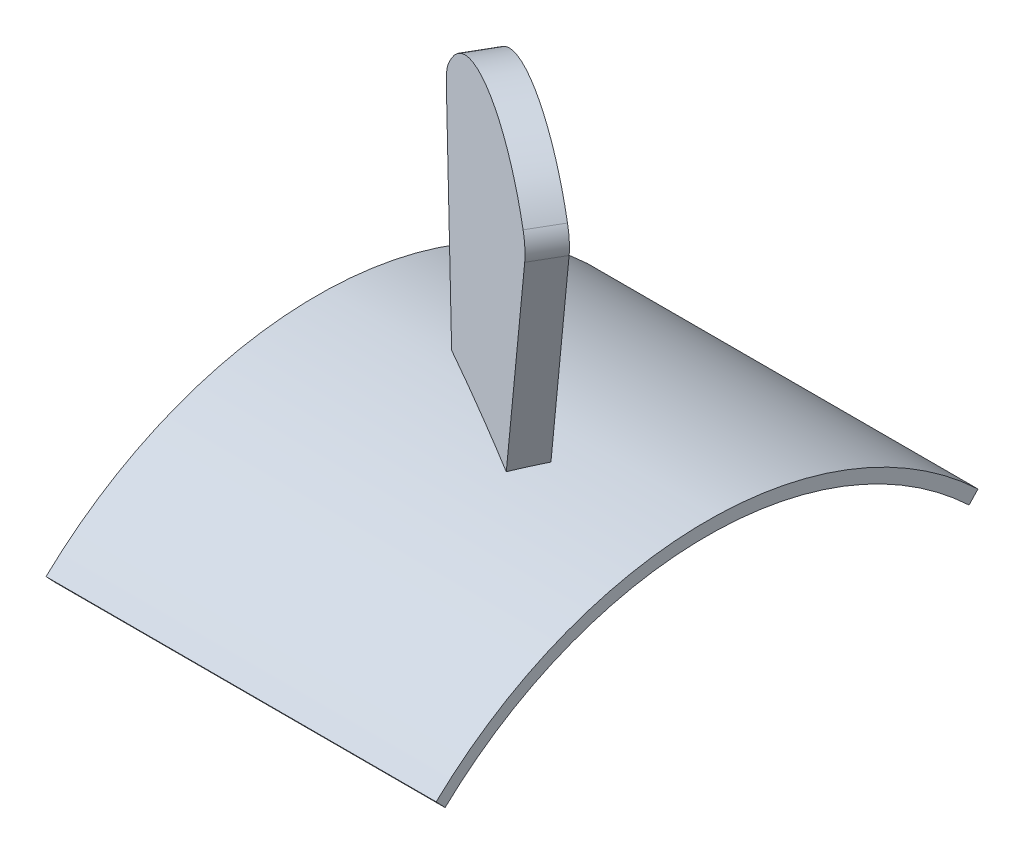
ISO-10303-21;
HEADER;
FILE_DESCRIPTION(('STEP AP214'),'2;1');
FILE_NAME('part.step','',(''),(''),'','','');
FILE_SCHEMA(('AUTOMOTIVE_DESIGN { 1 0 10303 214 1 1 1 1 }'));
ENDSEC;
DATA;
#1=APPLICATION_CONTEXT('core data for automotive mechanical design processes');
#2=APPLICATION_PROTOCOL_DEFINITION('international standard','automotive_design',2000,#1);
#3=PRODUCT_CONTEXT('',#1,'mechanical');
#4=PRODUCT('Part','Part','',(#3));
#5=PRODUCT_RELATED_PRODUCT_CATEGORY('part','',(#4));
#6=PRODUCT_DEFINITION_FORMATION('','',#4);
#7=PRODUCT_DEFINITION_CONTEXT('part definition',#1,'design');
#8=PRODUCT_DEFINITION('design','',#6,#7);
#9=PRODUCT_DEFINITION_SHAPE('','',#8);
#10=(LENGTH_UNIT() NAMED_UNIT(*) SI_UNIT(.MILLI.,.METRE.));
#11=(NAMED_UNIT(*) PLANE_ANGLE_UNIT() SI_UNIT($,.RADIAN.));
#12=(NAMED_UNIT(*) SI_UNIT($,.STERADIAN.) SOLID_ANGLE_UNIT());
#13=UNCERTAINTY_MEASURE_WITH_UNIT(LENGTH_MEASURE(1.E-05),#10,'distance_accuracy_value','');
#14=(GEOMETRIC_REPRESENTATION_CONTEXT(3) GLOBAL_UNCERTAINTY_ASSIGNED_CONTEXT((#13)) GLOBAL_UNIT_ASSIGNED_CONTEXT((#10,
#11,#12)) REPRESENTATION_CONTEXT('',''));
#15=CARTESIAN_POINT('',(0.,0.,0.));
#16=DIRECTION('',(0.,0.,1.));
#17=DIRECTION('',(1.,0.,0.));
#18=AXIS2_PLACEMENT_3D('',#15,#16,#17);
#19=CARTESIAN_POINT('',(-76.2,-55.8967886761865,-12.5367072563237));
#20=DIRECTION('',(1.,0.,0.));
#21=DIRECTION('',(0.,0.,-1.));
#22=AXIS2_PLACEMENT_3D('',#19,#20,#21);
#23=CYLINDRICAL_SURFACE('',#22,76.9679989622607);
#24=CARTESIAN_POINT('',(0.,-55.8967886761865,-12.5367072563237));
#25=DIRECTION('',(-1.,0.,0.));
#26=DIRECTION('',(0.,0.,1.));
#27=AXIS2_PLACEMENT_3D('',#24,#25,#26);
#28=CIRCLE('',#27,76.9679989622607);
#29=CARTESIAN_POINT('',(0.,0.,40.3747459456468));
#30=VERTEX_POINT('',#29);
#31=CARTESIAN_POINT('',(0.,0.,-65.4481604582942));
#32=VERTEX_POINT('',#31);
#33=EDGE_CURVE('E174',#30,#32,#28,.T.);
#34=ORIENTED_EDGE('',*,*,#33,.T.);
#35=DIRECTION('',(1.,0.,0.));
#36=VECTOR('',#35,1.);
#37=CARTESIAN_POINT('',(-76.2,0.,-65.4481604582942));
#38=LINE('',#37,#36);
#39=CARTESIAN_POINT('',(-76.2,0.,-65.4481604582942));
#40=VERTEX_POINT('',#39);
#41=EDGE_CURVE('E182',#40,#32,#38,.T.);
#42=ORIENTED_EDGE('',*,*,#41,.F.);
#43=CARTESIAN_POINT('',(-76.2,-55.8967886761865,-12.5367072563237));
#44=DIRECTION('',(-1.,0.,0.));
#45=DIRECTION('',(0.,0.,1.));
#46=AXIS2_PLACEMENT_3D('',#43,#44,#45);
#47=CIRCLE('',#46,76.9679989622607);
#48=CARTESIAN_POINT('',(-76.2,0.,40.3747459456468));
#49=VERTEX_POINT('',#48);
#50=EDGE_CURVE('E164',#49,#40,#47,.T.);
#51=ORIENTED_EDGE('',*,*,#50,.F.);
#52=DIRECTION('',(1.,0.,0.));
#53=VECTOR('',#52,1.);
#54=CARTESIAN_POINT('',(-76.2,0.,40.3747459456468));
#55=LINE('',#54,#53);
#56=EDGE_CURVE('E179',#49,#30,#55,.T.);
#57=ORIENTED_EDGE('',*,*,#56,.T.);
#58=EDGE_LOOP('',(#34,#42,#51,#57));
#59=FACE_BOUND('',#58,.T.);
#60=CARTESIAN_POINT('',(-46.9566758349653,-55.8967886761865,-12.5367072563237));
#61=DIRECTION('',(0.500000000000001,0.,-0.866025403784438));
#62=DIRECTION('',(0.866025403784438,0.,0.500000000000001));
#63=AXIS2_PLACEMENT_3D('',#60,#61,#62);
#64=ELLIPSE('',#63,153.935997924521,76.9679989622607);
#65=CARTESIAN_POINT('',(-53.8980149488679,20.96680566268,-16.5442912622719));
#66=VERTEX_POINT('',#65);
#67=CARTESIAN_POINT('',(-28.645425498914,20.3416895875139,-1.96470194560584));
#68=VERTEX_POINT('',#67);
#69=EDGE_CURVE('E11',#66,#68,#64,.T.);
#70=ORIENTED_EDGE('',*,*,#69,.F.);
#71=CARTESIAN_POINT('',(-50.40498986879,-55.8967886761865,-12.5367072563237));
#72=DIRECTION('',(0.864177822930487,0.0652859388140458,0.498933298696623));
#73=DIRECTION('',(0.50318653634127,-0.112122754480917,-0.856873268093064));
#74=AXIS2_PLACEMENT_3D('',#71,#72,#73);
#75=ELLIPSE('',#74,89.0650013457379,76.9679989622607);
#76=CARTESIAN_POINT('',(-50.6956472551867,20.4837909048581,-22.0277518309891));
#77=VERTEX_POINT('',#76);
#78=EDGE_CURVE('E188',#77,#66,#75,.T.);
#79=ORIENTED_EDGE('',*,*,#78,.F.);
#80=CARTESIAN_POINT('',(-34.2566758349653,-55.8967886761865,-12.5367072563237));
#81=DIRECTION('',(0.500000000000001,0.,-0.866025403784438));
#82=DIRECTION('',(0.866025403784438,0.,0.500000000000001));
#83=AXIS2_PLACEMENT_3D('',#80,#81,#82);
#84=ELLIPSE('',#83,153.935997924521,76.9679989622607);
#85=CARTESIAN_POINT('',(-25.3577001826257,20.8995368112194,-7.3988812679335));
#86=VERTEX_POINT('',#85);
#87=EDGE_CURVE('E178',#77,#86,#84,.T.);
#88=ORIENTED_EDGE('',*,*,#87,.T.);
#89=CARTESIAN_POINT('',(-43.0825599646412,-55.8967886761865,-12.5367072563237));
#90=DIRECTION('',(-0.843371350266149,0.227229005044841,-0.486920676102981));
#91=DIRECTION('',(0.537331150735049,0.356648656126016,-0.764249285595515));
#92=AXIS2_PLACEMENT_3D('',#89,#90,#91);
#93=ELLIPSE('',#92,91.2622878853678,76.9679989622607);
#94=EDGE_CURVE('E39',#68,#86,#93,.T.);
#95=ORIENTED_EDGE('',*,*,#94,.F.);
#96=EDGE_LOOP('',(#70,#79,#88,#95));
#97=FACE_BOUND('',#96,.T.);
#98=ADVANCED_FACE('F31',(#59,#97),#23,.T.);
#99=CARTESIAN_POINT('',(-76.2,-55.8967886761865,-12.5367072563237));
#100=DIRECTION('',(1.,0.,0.));
#101=DIRECTION('',(0.,0.,-1.));
#102=AXIS2_PLACEMENT_3D('',#99,#100,#101);
#103=CYLINDRICAL_SURFACE('',#102,74.4279989622607);
#104=CARTESIAN_POINT('',(0.,-55.8967886761865,-12.5367072563237));
#105=DIRECTION('',(1.,0.,0.));
#106=DIRECTION('',(0.,0.,-1.));
#107=AXIS2_PLACEMENT_3D('',#104,#105,#106);
#108=CIRCLE('',#107,74.4279989622607);
#109=CARTESIAN_POINT('',(0.,-1.84463472029627,38.6286294693837));
#110=VERTEX_POINT('',#109);
#111=CARTESIAN_POINT('',(0.,-1.84463472029628,-63.7020439820311));
#112=VERTEX_POINT('',#111);
#113=EDGE_CURVE('E130',#110,#112,#108,.F.);
#114=ORIENTED_EDGE('',*,*,#113,.F.);
#115=DIRECTION('',(1.,0.,0.));
#116=VECTOR('',#115,1.);
#117=CARTESIAN_POINT('',(-76.2,-1.84463472029627,38.6286294693837));
#118=LINE('',#117,#116);
#119=CARTESIAN_POINT('',(-76.2,-1.84463472029627,38.6286294693837));
#120=VERTEX_POINT('',#119);
#121=EDGE_CURVE('E55',#120,#110,#118,.T.);
#122=ORIENTED_EDGE('',*,*,#121,.F.);
#123=CARTESIAN_POINT('',(-76.2,-55.8967886761865,-12.5367072563237));
#124=DIRECTION('',(1.,0.,0.));
#125=DIRECTION('',(0.,0.,-1.));
#126=AXIS2_PLACEMENT_3D('',#123,#124,#125);
#127=CIRCLE('',#126,74.4279989622607);
#128=CARTESIAN_POINT('',(-76.2,-1.84463472029628,-63.7020439820311));
#129=VERTEX_POINT('',#128);
#130=EDGE_CURVE('E160',#120,#129,#127,.F.);
#131=ORIENTED_EDGE('',*,*,#130,.T.);
#132=DIRECTION('',(1.,0.,0.));
#133=VECTOR('',#132,1.);
#134=CARTESIAN_POINT('',(-76.2,-1.84463472029628,-63.7020439820311));
#135=LINE('',#134,#133);
#136=EDGE_CURVE('E168',#129,#112,#135,.T.);
#137=ORIENTED_EDGE('',*,*,#136,.T.);
#138=EDGE_LOOP('',(#114,#122,#131,#137));
#139=FACE_BOUND('',#138,.T.);
#140=ADVANCED_FACE('F33',(#139),#103,.F.);
#141=CARTESIAN_POINT('',(-76.2,-1.84463472029627,38.6286294693837));
#142=DIRECTION('',(0.,0.687447431599648,-0.726234141848927));
#143=DIRECTION('',(0.,0.726234141848927,0.687447431599648));
#144=AXIS2_PLACEMENT_3D('',#141,#142,#143);
#145=PLANE('',#144);
#146=DIRECTION('',(0.,0.726234141848927,0.687447431599648));
#147=VECTOR('',#146,1.);
#148=CARTESIAN_POINT('',(0.,-1.84463472029627,38.6286294693837));
#149=LINE('',#148,#147);
#150=EDGE_CURVE('E162',#110,#30,#149,.T.);
#151=ORIENTED_EDGE('',*,*,#150,.T.);
#152=ORIENTED_EDGE('',*,*,#56,.F.);
#153=DIRECTION('',(0.,0.726234141848927,0.687447431599648));
#154=VECTOR('',#153,1.);
#155=CARTESIAN_POINT('',(-76.2,-1.84463472029627,38.6286294693837));
#156=LINE('',#155,#154);
#157=EDGE_CURVE('E166',#120,#49,#156,.T.);
#158=ORIENTED_EDGE('',*,*,#157,.F.);
#159=ORIENTED_EDGE('',*,*,#121,.T.);
#160=EDGE_LOOP('',(#151,#152,#158,#159));
#161=FACE_BOUND('',#160,.T.);
#162=ADVANCED_FACE('F219',(#161),#145,.F.);
#163=CARTESIAN_POINT('',(-76.2,0.,-65.4481604582942));
#164=DIRECTION('',(0.,0.687447431599647,0.726234141848928));
#165=DIRECTION('',(0.,-0.726234141848928,0.687447431599647));
#166=AXIS2_PLACEMENT_3D('',#163,#164,#165);
#167=PLANE('',#166);
#168=DIRECTION('',(0.,-0.726234141848928,0.687447431599647));
#169=VECTOR('',#168,1.);
#170=CARTESIAN_POINT('',(0.,0.,-65.4481604582942));
#171=LINE('',#170,#169);
#172=EDGE_CURVE('E171',#32,#112,#171,.T.);
#173=ORIENTED_EDGE('',*,*,#172,.T.);
#174=ORIENTED_EDGE('',*,*,#136,.F.);
#175=DIRECTION('',(0.,-0.726234141848928,0.687447431599647));
#176=VECTOR('',#175,1.);
#177=CARTESIAN_POINT('',(-76.2,0.,-65.4481604582942));
#178=LINE('',#177,#176);
#179=EDGE_CURVE('E81',#40,#129,#178,.T.);
#180=ORIENTED_EDGE('',*,*,#179,.F.);
#181=ORIENTED_EDGE('',*,*,#41,.T.);
#182=EDGE_LOOP('',(#173,#174,#180,#181));
#183=FACE_BOUND('',#182,.T.);
#184=ADVANCED_FACE('F222',(#183),#167,.F.);
#185=CARTESIAN_POINT('',(-76.2,-55.8967886761865,-12.5367072563237));
#186=DIRECTION('',(1.,0.,0.));
#187=DIRECTION('',(0.,0.,-1.));
#188=AXIS2_PLACEMENT_3D('',#185,#186,#187);
#189=PLANE('',#188);
#190=ORIENTED_EDGE('',*,*,#130,.F.);
#191=ORIENTED_EDGE('',*,*,#157,.T.);
#192=ORIENTED_EDGE('',*,*,#50,.T.);
#193=ORIENTED_EDGE('',*,*,#179,.T.);
#194=EDGE_LOOP('',(#190,#191,#192,#193));
#195=FACE_BOUND('',#194,.T.);
#196=ADVANCED_FACE('F224',(#195),#189,.F.);
#197=CARTESIAN_POINT('',(0.,-55.8967886761865,-12.5367072563237));
#198=DIRECTION('',(1.,0.,0.));
#199=DIRECTION('',(0.,0.,-1.));
#200=AXIS2_PLACEMENT_3D('',#197,#198,#199);
#201=PLANE('',#200);
#202=ORIENTED_EDGE('',*,*,#113,.T.);
#203=ORIENTED_EDGE('',*,*,#172,.F.);
#204=ORIENTED_EDGE('',*,*,#33,.F.);
#205=ORIENTED_EDGE('',*,*,#150,.F.);
#206=EDGE_LOOP('',(#202,#203,#204,#205));
#207=FACE_BOUND('',#206,.T.);
#208=ADVANCED_FACE('F230',(#207),#201,.T.);
#209=CARTESIAN_POINT('',(-28.8445220472549,19.3564144035676,-2.07965039138519));
#210=DIRECTION('',(-0.843371350266149,0.227229005044841,-0.486920676102981));
#211=DIRECTION('',(-0.500000000000001,0.,0.866025403784438));
#212=AXIS2_PLACEMENT_3D('',#209,#210,#211);
#213=PLANE('',#212);
#214=DIRECTION('',(0.196786090845494,0.97384135220596,0.113614502522421));
#215=VECTOR('',#214,1.);
#216=CARTESIAN_POINT('',(-28.8445220472549,19.3564144035676,-2.07965039138519));
#217=LINE('',#216,#215);
#218=CARTESIAN_POINT('',(-20.1325206390298,62.4697624829673,2.95022596683399));
#219=VERTEX_POINT('',#218);
#220=EDGE_CURVE('E114',#68,#219,#217,.T.);
#221=ORIENTED_EDGE('',*,*,#220,.F.);
#222=ORIENTED_EDGE('',*,*,#94,.T.);
#223=DIRECTION('',(0.196786090845494,0.97384135220596,0.113614502522421));
#224=VECTOR('',#223,1.);
#225=CARTESIAN_POINT('',(-25.6695220472549,19.3564144035676,-7.57891170541638));
#226=LINE('',#225,#224);
#227=CARTESIAN_POINT('',(-16.9575206390298,62.4697624829673,-2.5490353471972));
#228=VERTEX_POINT('',#227);
#229=EDGE_CURVE('E46',#86,#228,#226,.T.);
#230=ORIENTED_EDGE('',*,*,#229,.T.);
#231=DIRECTION('',(0.500000000000001,0.,-0.866025403784438));
#232=VECTOR('',#231,1.);
#233=CARTESIAN_POINT('',(-20.1325206390298,62.4697624829673,2.95022596683399));
#234=LINE('',#233,#232);
#235=EDGE_CURVE('E127',#219,#228,#234,.T.);
#236=ORIENTED_EDGE('',*,*,#235,.F.);
#237=EDGE_LOOP('',(#221,#222,#230,#236));
#238=FACE_BOUND('',#237,.T.);
#239=ADVANCED_FACE('F128',(#238),#213,.F.);
#240=CARTESIAN_POINT('',(-53.8067699217282,19.3564144035676,-16.4916109212906));
#241=DIRECTION('',(0.864177822930487,0.0652859388140458,0.498933298696623));
#242=DIRECTION('',(0.500000000000001,0.,-0.866025403784438));
#243=AXIS2_PLACEMENT_3D('',#240,#241,#242);
#244=PLANE('',#243);
#245=DIRECTION('',(0.0565392815228801,-0.997866597393243,0.0326429694070229));
#246=VECTOR('',#245,1.);
#247=CARTESIAN_POINT('',(-50.6317699217282,19.3564144035676,-21.9908722353218));
#248=LINE('',#247,#246);
#249=CARTESIAN_POINT('',(-53.1761066463645,64.2616300633753,-23.4598457281996));
#250=VERTEX_POINT('',#249);
#251=EDGE_CURVE('E124',#250,#77,#248,.T.);
#252=ORIENTED_EDGE('',*,*,#251,.T.);
#253=ORIENTED_EDGE('',*,*,#78,.T.);
#254=DIRECTION('',(0.0565392815228801,-0.997866597393243,0.0326429694070229));
#255=VECTOR('',#254,1.);
#256=CARTESIAN_POINT('',(-53.8067699217282,19.3564144035676,-16.4916109212906));
#257=LINE('',#256,#255);
#258=CARTESIAN_POINT('',(-56.3511066463645,64.2616300633753,-17.9605844141684));
#259=VERTEX_POINT('',#258);
#260=EDGE_CURVE('E142',#259,#66,#257,.T.);
#261=ORIENTED_EDGE('',*,*,#260,.F.);
#262=DIRECTION('',(0.500000000000001,0.,-0.866025403784438));
#263=VECTOR('',#262,1.);
#264=CARTESIAN_POINT('',(-56.3511066463645,64.2616300633753,-17.9605844141684));
#265=LINE('',#264,#263);
#266=EDGE_CURVE('E144',#259,#250,#265,.T.);
#267=ORIENTED_EDGE('',*,*,#266,.T.);
#268=EDGE_LOOP('',(#252,#253,#261,#267));
#269=FACE_BOUND('',#268,.T.);
#270=ADVANCED_FACE('F195',(#269),#244,.F.);
#271=CARTESIAN_POINT('',(-25.4879287132198,63.9126666650021,-0.14172032641994));
#272=DIRECTION('',(0.500000000000001,0.,-0.866025403784438));
#273=DIRECTION('',(-0.866025403784438,0.,-0.500000000000001));
#274=AXIS2_PLACEMENT_3D('',#271,#272,#273);
#275=PLANE('',#274);
#276=ORIENTED_EDGE('',*,*,#260,.T.);
#277=ORIENTED_EDGE('',*,*,#69,.T.);
#278=ORIENTED_EDGE('',*,*,#220,.T.);
#279=CARTESIAN_POINT('',(-25.4879287132198,63.9126666650021,-0.14172032641994));
#280=DIRECTION('',(-0.500000000000001,0.,0.866025403784438));
#281=DIRECTION('',(-0.866025403784438,0.,-0.500000000000001));
#282=AXIS2_PLACEMENT_3D('',#279,#280,#281);
#283=CIRCLE('',#282,6.35);
#284=CARTESIAN_POINT('',(-20.8783094695368,67.3754758190978,2.51964458478216));
#285=VERTEX_POINT('',#284);
#286=EDGE_CURVE('E119',#219,#285,#283,.T.);
#287=ORIENTED_EDGE('',*,*,#286,.T.);
#288=CARTESIAN_POINT('',(-38.4033161229476,54.2104506278779,-7.5984227241146));
#289=DIRECTION('',(-0.500000000000001,0.,0.866025403784438));
#290=DIRECTION('',(0.866025403784438,0.,0.500000000000001));
#291=AXIS2_PLACEMENT_3D('',#288,#289,#290);
#292=CIRCLE('',#291,24.1416451915547);
#293=CARTESIAN_POINT('',(-55.310758083156,68.411515413232,-17.3599388911489));
#294=VERTEX_POINT('',#293);
#295=EDGE_CURVE('E136',#285,#294,#292,.T.);
#296=ORIENTED_EDGE('',*,*,#295,.T.);
#297=CARTESIAN_POINT('',(-50.863577470756,64.6761957748445,-14.7923579674449));
#298=DIRECTION('',(-0.500000000000001,0.,0.866025403784438));
#299=DIRECTION('',(-0.866025403784438,0.,-0.500000000000001));
#300=AXIS2_PLACEMENT_3D('',#297,#298,#299);
#301=CIRCLE('',#300,6.34999999999999);
#302=EDGE_CURVE('E138',#294,#259,#301,.T.);
#303=ORIENTED_EDGE('',*,*,#302,.T.);
#304=EDGE_LOOP('',(#276,#277,#278,#287,#296,#303));
#305=FACE_BOUND('',#304,.T.);
#306=ADVANCED_FACE('F117',(#305),#275,.F.);
#307=CARTESIAN_POINT('',(-22.3129287132198,63.9126666650021,-5.64098164045112));
#308=DIRECTION('',(0.500000000000001,0.,-0.866025403784438));
#309=DIRECTION('',(-0.866025403784438,0.,-0.500000000000001));
#310=AXIS2_PLACEMENT_3D('',#307,#308,#309);
#311=PLANE('',#310);
#312=ORIENTED_EDGE('',*,*,#87,.F.);
#313=ORIENTED_EDGE('',*,*,#251,.F.);
#314=CARTESIAN_POINT('',(-47.688577470756,64.6761957748445,-20.291619281476));
#315=DIRECTION('',(-0.500000000000001,0.,0.866025403784438));
#316=DIRECTION('',(-0.866025403784438,0.,-0.500000000000001));
#317=AXIS2_PLACEMENT_3D('',#314,#315,#316);
#318=CIRCLE('',#317,6.34999999999999);
#319=CARTESIAN_POINT('',(-52.135758083156,68.411515413232,-22.8592002051801));
#320=VERTEX_POINT('',#319);
#321=EDGE_CURVE('E150',#320,#250,#318,.T.);
#322=ORIENTED_EDGE('',*,*,#321,.F.);
#323=CARTESIAN_POINT('',(-35.2283161229476,54.2104506278779,-13.0976840381458));
#324=DIRECTION('',(-0.500000000000001,0.,0.866025403784438));
#325=DIRECTION('',(0.866025403784438,0.,0.500000000000001));
#326=AXIS2_PLACEMENT_3D('',#323,#324,#325);
#327=CIRCLE('',#326,24.1416451915547);
#328=CARTESIAN_POINT('',(-17.7033094695368,67.3754758190978,-2.97961672924903));
#329=VERTEX_POINT('',#328);
#330=EDGE_CURVE('E148',#329,#320,#327,.T.);
#331=ORIENTED_EDGE('',*,*,#330,.F.);
#332=CARTESIAN_POINT('',(-22.3129287132198,63.9126666650021,-5.64098164045112));
#333=DIRECTION('',(-0.500000000000001,0.,0.866025403784438));
#334=DIRECTION('',(-0.866025403784438,0.,-0.500000000000001));
#335=AXIS2_PLACEMENT_3D('',#332,#333,#334);
#336=CIRCLE('',#335,6.35);
#337=EDGE_CURVE('E146',#228,#329,#336,.T.);
#338=ORIENTED_EDGE('',*,*,#337,.F.);
#339=ORIENTED_EDGE('',*,*,#229,.F.);
#340=EDGE_LOOP('',(#312,#313,#322,#331,#338,#339));
#341=FACE_BOUND('',#340,.T.);
#342=ADVANCED_FACE('F192',(#341),#311,.T.);
#343=CARTESIAN_POINT('',(-25.4879287132198,63.9126666650021,-0.14172032641994));
#344=DIRECTION('',(0.500000000000001,0.,-0.866025403784438));
#345=DIRECTION('',(-0.866025403784438,0.,-0.500000000000001));
#346=AXIS2_PLACEMENT_3D('',#343,#344,#345);
#347=CYLINDRICAL_SURFACE('',#346,6.35);
#348=ORIENTED_EDGE('',*,*,#337,.T.);
#349=DIRECTION('',(0.500000000000001,0.,-0.866025403784438));
#350=VECTOR('',#349,1.);
#351=CARTESIAN_POINT('',(-20.8783094695368,67.3754758190978,2.51964458478216));
#352=LINE('',#351,#350);
#353=EDGE_CURVE('E131',#285,#329,#352,.T.);
#354=ORIENTED_EDGE('',*,*,#353,.F.);
#355=ORIENTED_EDGE('',*,*,#286,.F.);
#356=ORIENTED_EDGE('',*,*,#235,.T.);
#357=EDGE_LOOP('',(#348,#354,#355,#356));
#358=FACE_BOUND('',#357,.T.);
#359=ADVANCED_FACE('F133',(#358),#347,.T.);
#360=CARTESIAN_POINT('',(-38.4033161229476,54.2104506278779,-7.5984227241146));
#361=DIRECTION('',(0.500000000000001,0.,-0.866025403784438));
#362=DIRECTION('',(-0.866025403784438,0.,-0.500000000000001));
#363=AXIS2_PLACEMENT_3D('',#360,#361,#362);
#364=CYLINDRICAL_SURFACE('',#363,24.1416451915547);
#365=ORIENTED_EDGE('',*,*,#330,.T.);
#366=DIRECTION('',(0.500000000000001,0.,-0.866025403784438));
#367=VECTOR('',#366,1.);
#368=CARTESIAN_POINT('',(-55.310758083156,68.411515413232,-17.3599388911489));
#369=LINE('',#368,#367);
#370=EDGE_CURVE('E156',#294,#320,#369,.T.);
#371=ORIENTED_EDGE('',*,*,#370,.F.);
#372=ORIENTED_EDGE('',*,*,#295,.F.);
#373=ORIENTED_EDGE('',*,*,#353,.T.);
#374=EDGE_LOOP('',(#365,#371,#372,#373));
#375=FACE_BOUND('',#374,.T.);
#376=ADVANCED_FACE('F204',(#375),#364,.T.);
#377=CARTESIAN_POINT('',(-50.863577470756,64.6761957748445,-14.7923579674449));
#378=DIRECTION('',(0.500000000000001,0.,-0.866025403784438));
#379=DIRECTION('',(-0.866025403784438,0.,-0.500000000000001));
#380=AXIS2_PLACEMENT_3D('',#377,#378,#379);
#381=CYLINDRICAL_SURFACE('',#380,6.34999999999999);
#382=ORIENTED_EDGE('',*,*,#321,.T.);
#383=ORIENTED_EDGE('',*,*,#266,.F.);
#384=ORIENTED_EDGE('',*,*,#302,.F.);
#385=ORIENTED_EDGE('',*,*,#370,.T.);
#386=EDGE_LOOP('',(#382,#383,#384,#385));
#387=FACE_BOUND('',#386,.T.);
#388=ADVANCED_FACE('F200',(#387),#381,.T.);
#389=CLOSED_SHELL('',(#98,#140,#162,#184,#196,#208,#239,#270,#306,#342,#359,#376,#388));
#390=MANIFOLD_SOLID_BREP('B2',#389);
#391=ADVANCED_BREP_SHAPE_REPRESENTATION('',(#18,#390),#14);
#392=SHAPE_DEFINITION_REPRESENTATION(#9,#391);
ENDSEC;
END-ISO-10303-21;
